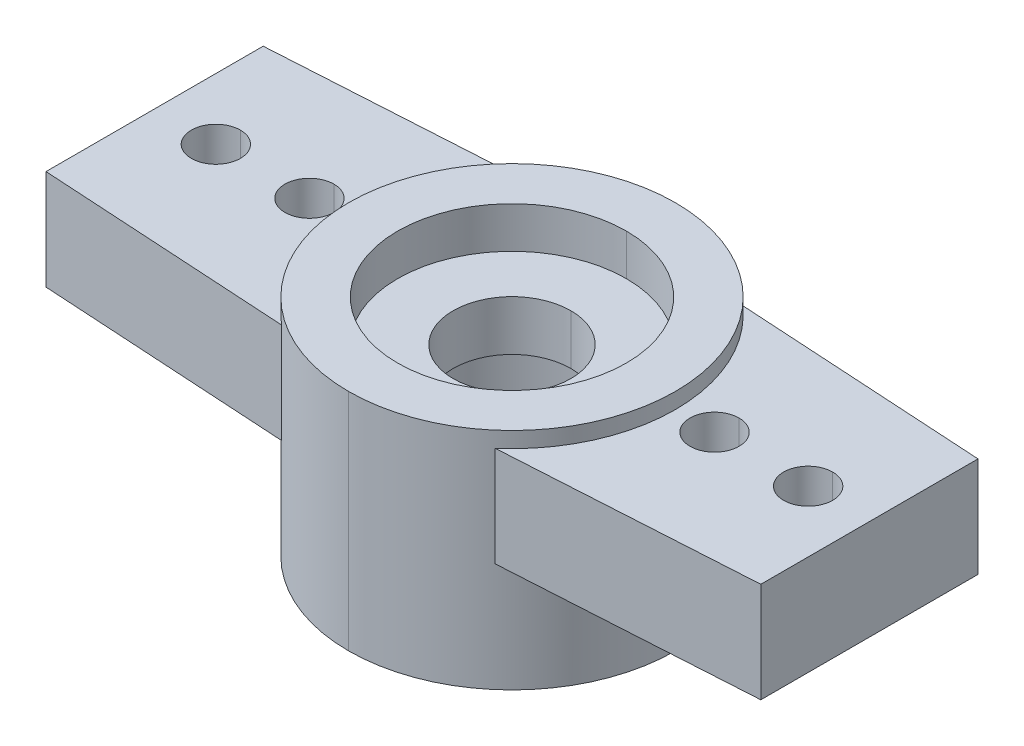
ISO-10303-21;
HEADER;
FILE_DESCRIPTION(('STEP AP214'),'2;1');
FILE_NAME('part.step','',(''),(''),'','','');
FILE_SCHEMA(('AUTOMOTIVE_DESIGN { 1 0 10303 214 1 1 1 1 }'));
ENDSEC;
DATA;
#1=APPLICATION_CONTEXT('core data for automotive mechanical design processes');
#2=APPLICATION_PROTOCOL_DEFINITION('international standard','automotive_design',2000,#1);
#3=PRODUCT_CONTEXT('',#1,'mechanical');
#4=PRODUCT('Part','Part','',(#3));
#5=PRODUCT_RELATED_PRODUCT_CATEGORY('part','',(#4));
#6=PRODUCT_DEFINITION_FORMATION('','',#4);
#7=PRODUCT_DEFINITION_CONTEXT('part definition',#1,'design');
#8=PRODUCT_DEFINITION('design','',#6,#7);
#9=PRODUCT_DEFINITION_SHAPE('','',#8);
#10=(LENGTH_UNIT() NAMED_UNIT(*) SI_UNIT(.MILLI.,.METRE.));
#11=(NAMED_UNIT(*) PLANE_ANGLE_UNIT() SI_UNIT($,.RADIAN.));
#12=(NAMED_UNIT(*) SI_UNIT($,.STERADIAN.) SOLID_ANGLE_UNIT());
#13=UNCERTAINTY_MEASURE_WITH_UNIT(LENGTH_MEASURE(1.E-05),#10,'distance_accuracy_value','');
#14=(GEOMETRIC_REPRESENTATION_CONTEXT(3) GLOBAL_UNCERTAINTY_ASSIGNED_CONTEXT((#13)) GLOBAL_UNIT_ASSIGNED_CONTEXT((#10,
#11,#12)) REPRESENTATION_CONTEXT('',''));
#15=CARTESIAN_POINT('',(0.,0.,0.));
#16=DIRECTION('',(0.,0.,1.));
#17=DIRECTION('',(1.,0.,0.));
#18=AXIS2_PLACEMENT_3D('',#15,#16,#17);
#19=CARTESIAN_POINT('',(0.,2.8,0.));
#20=DIRECTION('',(0.,-1.,0.));
#21=DIRECTION('',(0.,0.,-1.));
#22=AXIS2_PLACEMENT_3D('',#19,#20,#21);
#23=PLANE('',#22);
#24=CARTESIAN_POINT('',(0.,2.8,0.));
#25=DIRECTION('',(0.,-1.,0.));
#26=DIRECTION('',(0.,0.,-1.));
#27=AXIS2_PLACEMENT_3D('',#24,#25,#26);
#28=CIRCLE('',#27,1.235);
#29=CARTESIAN_POINT('',(0.,2.8,-1.235));
#30=VERTEX_POINT('',#29);
#31=CARTESIAN_POINT('',(0.,2.8,1.235));
#32=VERTEX_POINT('',#31);
#33=EDGE_CURVE('E408',#30,#32,#28,.T.);
#34=ORIENTED_EDGE('',*,*,#33,.F.);
#35=CARTESIAN_POINT('',(0.,2.8,0.));
#36=DIRECTION('',(0.,-1.,0.));
#37=DIRECTION('',(0.,0.,-1.));
#38=AXIS2_PLACEMENT_3D('',#35,#36,#37);
#39=CIRCLE('',#38,1.235);
#40=EDGE_CURVE('E351',#32,#30,#39,.T.);
#41=ORIENTED_EDGE('',*,*,#40,.F.);
#42=EDGE_LOOP('',(#34,#41));
#43=FACE_BOUND('',#42,.T.);
#44=CARTESIAN_POINT('',(0.,2.8,0.));
#45=DIRECTION('',(0.,-1.,0.));
#46=DIRECTION('',(0.,0.,-1.));
#47=AXIS2_PLACEMENT_3D('',#44,#45,#46);
#48=CIRCLE('',#47,2.345);
#49=CARTESIAN_POINT('',(0.,2.8,-2.345));
#50=VERTEX_POINT('',#49);
#51=CARTESIAN_POINT('',(0.,2.8,2.345));
#52=VERTEX_POINT('',#51);
#53=EDGE_CURVE('E312',#50,#52,#48,.T.);
#54=ORIENTED_EDGE('',*,*,#53,.T.);
#55=CARTESIAN_POINT('',(0.,2.8,0.));
#56=DIRECTION('',(0.,-1.,0.));
#57=DIRECTION('',(0.,0.,-1.));
#58=AXIS2_PLACEMENT_3D('',#55,#56,#57);
#59=CIRCLE('',#58,2.345);
#60=EDGE_CURVE('E299',#52,#50,#59,.T.);
#61=ORIENTED_EDGE('',*,*,#60,.T.);
#62=EDGE_LOOP('',(#54,#61));
#63=FACE_BOUND('',#62,.T.);
#64=ADVANCED_FACE('F42',(#43,#63),#23,.T.);
#65=CARTESIAN_POINT('',(0.,2.8,0.));
#66=DIRECTION('',(0.,-1.,0.));
#67=DIRECTION('',(0.,0.,-1.));
#68=AXIS2_PLACEMENT_3D('',#65,#66,#67);
#69=CYLINDRICAL_SURFACE('',#68,2.345);
#70=DIRECTION('',(0.,-1.,0.));
#71=VECTOR('',#70,1.);
#72=CARTESIAN_POINT('',(0.,2.8,2.345));
#73=LINE('',#72,#71);
#74=CARTESIAN_POINT('',(0.,0.,2.345));
#75=VERTEX_POINT('',#74);
#76=EDGE_CURVE('E275',#52,#75,#73,.T.);
#77=ORIENTED_EDGE('',*,*,#76,.F.);
#78=ORIENTED_EDGE('',*,*,#53,.F.);
#79=DIRECTION('',(0.,-1.,0.));
#80=VECTOR('',#79,1.);
#81=CARTESIAN_POINT('',(0.,2.8,-2.345));
#82=LINE('',#81,#80);
#83=CARTESIAN_POINT('',(0.,0.,-2.345));
#84=VERTEX_POINT('',#83);
#85=EDGE_CURVE('E281',#50,#84,#82,.T.);
#86=ORIENTED_EDGE('',*,*,#85,.T.);
#87=CARTESIAN_POINT('',(0.,0.,0.));
#88=DIRECTION('',(0.,-1.,0.));
#89=DIRECTION('',(0.,0.,-1.));
#90=AXIS2_PLACEMENT_3D('',#87,#88,#89);
#91=CIRCLE('',#90,2.345);
#92=EDGE_CURVE('E294',#84,#75,#91,.T.);
#93=ORIENTED_EDGE('',*,*,#92,.T.);
#94=EDGE_LOOP('',(#77,#78,#86,#93));
#95=FACE_BOUND('',#94,.T.);
#96=ADVANCED_FACE('F513',(#95),#69,.F.);
#97=CARTESIAN_POINT('',(0.,4.385,0.));
#98=DIRECTION('',(0.,1.,0.));
#99=DIRECTION('',(1.,0.,0.));
#100=AXIS2_PLACEMENT_3D('',#97,#98,#99);
#101=PLANE('',#100);
#102=DIRECTION('',(0.,0.,1.));
#103=VECTOR('',#102,1.);
#104=CARTESIAN_POINT('',(7.5,4.385,0.));
#105=LINE('',#104,#103);
#106=CARTESIAN_POINT('',(7.5,4.385,-2.27874688128844));
#107=VERTEX_POINT('',#106);
#108=CARTESIAN_POINT('',(7.5,4.385,2.27874688128845));
#109=VERTEX_POINT('',#108);
#110=EDGE_CURVE('E303',#107,#109,#105,.T.);
#111=ORIENTED_EDGE('',*,*,#110,.F.);
#112=DIRECTION('',(0.99819540210647,0.,0.0600494730493309));
#113=VECTOR('',#112,1.);
#114=CARTESIAN_POINT('',(0.163635156781981,4.385,-2.72008816777726));
#115=LINE('',#114,#113);
#116=CARTESIAN_POINT('',(2.24296121232624,4.385,-2.595));
#117=VERTEX_POINT('',#116);
#118=EDGE_CURVE('E330',#117,#107,#115,.T.);
#119=ORIENTED_EDGE('',*,*,#118,.F.);
#120=CARTESIAN_POINT('',(0.,4.385,0.));
#121=DIRECTION('',(0.,-1.,0.));
#122=DIRECTION('',(0.,0.,1.));
#123=AXIS2_PLACEMENT_3D('',#120,#121,#122);
#124=CIRCLE('',#123,3.43);
#125=CARTESIAN_POINT('',(2.24296121232624,4.385,2.595));
#126=VERTEX_POINT('',#125);
#127=EDGE_CURVE('E323',#117,#126,#124,.T.);
#128=ORIENTED_EDGE('',*,*,#127,.T.);
#129=DIRECTION('',(0.99819540210647,0.,-0.060049473049331));
#130=VECTOR('',#129,1.);
#131=CARTESIAN_POINT('',(0.163635156781981,4.385,2.72008816777726));
#132=LINE('',#131,#130);
#133=EDGE_CURVE('E433',#126,#109,#132,.T.);
#134=ORIENTED_EDGE('',*,*,#133,.T.);
#135=EDGE_LOOP('',(#111,#119,#128,#134));
#136=FACE_BOUND('',#135,.T.);
#137=CARTESIAN_POINT('',(4.25,4.385,0.));
#138=DIRECTION('',(0.,-1.,0.));
#139=DIRECTION('',(0.,0.,1.));
#140=AXIS2_PLACEMENT_3D('',#137,#138,#139);
#141=CIRCLE('',#140,0.515);
#142=CARTESIAN_POINT('',(4.25,4.385,0.515));
#143=VERTEX_POINT('',#142);
#144=CARTESIAN_POINT('',(4.25,4.385,-0.515));
#145=VERTEX_POINT('',#144);
#146=EDGE_CURVE('E424',#143,#145,#141,.T.);
#147=ORIENTED_EDGE('',*,*,#146,.T.);
#148=CARTESIAN_POINT('',(4.25,4.385,0.));
#149=DIRECTION('',(0.,-1.,0.));
#150=DIRECTION('',(0.,0.,1.));
#151=AXIS2_PLACEMENT_3D('',#148,#149,#150);
#152=CIRCLE('',#151,0.515);
#153=EDGE_CURVE('E309',#145,#143,#152,.T.);
#154=ORIENTED_EDGE('',*,*,#153,.T.);
#155=EDGE_LOOP('',(#147,#154));
#156=FACE_BOUND('',#155,.T.);
#157=CARTESIAN_POINT('',(6.214,4.385,0.));
#158=DIRECTION('',(0.,-1.,0.));
#159=DIRECTION('',(0.,0.,1.));
#160=AXIS2_PLACEMENT_3D('',#157,#158,#159);
#161=CIRCLE('',#160,0.515);
#162=CARTESIAN_POINT('',(6.214,4.385,0.515000000000014));
#163=VERTEX_POINT('',#162);
#164=CARTESIAN_POINT('',(6.214,4.385,-0.514999999999986));
#165=VERTEX_POINT('',#164);
#166=EDGE_CURVE('E336',#163,#165,#161,.T.);
#167=ORIENTED_EDGE('',*,*,#166,.T.);
#168=CARTESIAN_POINT('',(6.214,4.385,0.));
#169=DIRECTION('',(0.,-1.,0.));
#170=DIRECTION('',(0.,0.,1.));
#171=AXIS2_PLACEMENT_3D('',#168,#169,#170);
#172=CIRCLE('',#171,0.515);
#173=EDGE_CURVE('E304',#165,#163,#172,.T.);
#174=ORIENTED_EDGE('',*,*,#173,.T.);
#175=EDGE_LOOP('',(#167,#174));
#176=FACE_BOUND('',#175,.T.);
#177=ADVANCED_FACE('F519',(#136,#156,#176),#101,.T.);
#178=CARTESIAN_POINT('',(0.,2.285,0.));
#179=DIRECTION('',(0.,1.,0.));
#180=DIRECTION('',(1.,0.,0.));
#181=AXIS2_PLACEMENT_3D('',#178,#179,#180);
#182=PLANE('',#181);
#183=CARTESIAN_POINT('',(4.25,2.285,0.));
#184=DIRECTION('',(0.,-1.,0.));
#185=DIRECTION('',(0.,0.,1.));
#186=AXIS2_PLACEMENT_3D('',#183,#184,#185);
#187=CIRCLE('',#186,0.515);
#188=CARTESIAN_POINT('',(4.25,2.285,0.515));
#189=VERTEX_POINT('',#188);
#190=CARTESIAN_POINT('',(4.25,2.285,-0.515));
#191=VERTEX_POINT('',#190);
#192=EDGE_CURVE('E277',#189,#191,#187,.T.);
#193=ORIENTED_EDGE('',*,*,#192,.F.);
#194=CARTESIAN_POINT('',(4.25,2.285,0.));
#195=DIRECTION('',(0.,-1.,0.));
#196=DIRECTION('',(0.,0.,1.));
#197=AXIS2_PLACEMENT_3D('',#194,#195,#196);
#198=CIRCLE('',#197,0.515);
#199=EDGE_CURVE('E306',#191,#189,#198,.T.);
#200=ORIENTED_EDGE('',*,*,#199,.F.);
#201=EDGE_LOOP('',(#193,#200));
#202=FACE_BOUND('',#201,.T.);
#203=CARTESIAN_POINT('',(6.214,2.285,0.));
#204=DIRECTION('',(0.,-1.,0.));
#205=DIRECTION('',(0.,0.,1.));
#206=AXIS2_PLACEMENT_3D('',#203,#204,#205);
#207=CIRCLE('',#206,0.515);
#208=CARTESIAN_POINT('',(6.214,2.285,0.515000000000014));
#209=VERTEX_POINT('',#208);
#210=CARTESIAN_POINT('',(6.214,2.285,-0.514999999999986));
#211=VERTEX_POINT('',#210);
#212=EDGE_CURVE('E342',#209,#211,#207,.T.);
#213=ORIENTED_EDGE('',*,*,#212,.F.);
#214=CARTESIAN_POINT('',(6.214,2.285,0.));
#215=DIRECTION('',(0.,-1.,0.));
#216=DIRECTION('',(0.,0.,1.));
#217=AXIS2_PLACEMENT_3D('',#214,#215,#216);
#218=CIRCLE('',#217,0.515);
#219=EDGE_CURVE('E307',#211,#209,#218,.T.);
#220=ORIENTED_EDGE('',*,*,#219,.F.);
#221=EDGE_LOOP('',(#213,#220));
#222=FACE_BOUND('',#221,.T.);
#223=DIRECTION('',(0.99819540210647,0.,0.0600494730493309));
#224=VECTOR('',#223,1.);
#225=CARTESIAN_POINT('',(0.163635156781981,2.285,-2.72008816777726));
#226=LINE('',#225,#224);
#227=CARTESIAN_POINT('',(2.24296121232624,2.285,-2.595));
#228=VERTEX_POINT('',#227);
#229=CARTESIAN_POINT('',(7.5,2.285,-2.27874688128845));
#230=VERTEX_POINT('',#229);
#231=EDGE_CURVE('E381',#228,#230,#226,.T.);
#232=ORIENTED_EDGE('',*,*,#231,.T.);
#233=DIRECTION('',(0.,0.,-1.));
#234=VECTOR('',#233,1.);
#235=CARTESIAN_POINT('',(7.5,2.285,2.27874688128845));
#236=LINE('',#235,#234);
#237=CARTESIAN_POINT('',(7.5,2.285,2.27874688128845));
#238=VERTEX_POINT('',#237);
#239=EDGE_CURVE('E57',#238,#230,#236,.T.);
#240=ORIENTED_EDGE('',*,*,#239,.F.);
#241=DIRECTION('',(0.99819540210647,0.,-0.060049473049331));
#242=VECTOR('',#241,1.);
#243=CARTESIAN_POINT('',(0.163635156781981,2.285,2.72008816777726));
#244=LINE('',#243,#242);
#245=CARTESIAN_POINT('',(2.24296121232624,2.285,2.595));
#246=VERTEX_POINT('',#245);
#247=EDGE_CURVE('E458',#246,#238,#244,.T.);
#248=ORIENTED_EDGE('',*,*,#247,.F.);
#249=CARTESIAN_POINT('',(0.,2.285,0.));
#250=DIRECTION('',(0.,-1.,0.));
#251=DIRECTION('',(0.,0.,1.));
#252=AXIS2_PLACEMENT_3D('',#249,#250,#251);
#253=CIRCLE('',#252,3.43);
#254=EDGE_CURVE('E324',#228,#246,#253,.T.);
#255=ORIENTED_EDGE('',*,*,#254,.F.);
#256=EDGE_LOOP('',(#232,#240,#248,#255));
#257=FACE_BOUND('',#256,.T.);
#258=ADVANCED_FACE('F527',(#202,#222,#257),#182,.F.);
#259=CARTESIAN_POINT('',(4.25,2.285,0.));
#260=DIRECTION('',(0.,1.,0.));
#261=DIRECTION('',(0.,0.,1.));
#262=AXIS2_PLACEMENT_3D('',#259,#260,#261);
#263=CYLINDRICAL_SURFACE('',#262,0.515);
#264=DIRECTION('',(0.,1.,0.));
#265=VECTOR('',#264,1.);
#266=CARTESIAN_POINT('',(4.25,2.285,-0.515));
#267=LINE('',#266,#265);
#268=EDGE_CURVE('E280',#191,#145,#267,.T.);
#269=ORIENTED_EDGE('',*,*,#268,.F.);
#270=ORIENTED_EDGE('',*,*,#199,.T.);
#271=DIRECTION('',(0.,1.,0.));
#272=VECTOR('',#271,1.);
#273=CARTESIAN_POINT('',(4.25,2.285,0.515));
#274=LINE('',#273,#272);
#275=EDGE_CURVE('E346',#189,#143,#274,.T.);
#276=ORIENTED_EDGE('',*,*,#275,.T.);
#277=ORIENTED_EDGE('',*,*,#153,.F.);
#278=EDGE_LOOP('',(#269,#270,#276,#277));
#279=FACE_BOUND('',#278,.T.);
#280=ADVANCED_FACE('F606',(#279),#263,.F.);
#281=CARTESIAN_POINT('',(6.214,2.285,0.));
#282=DIRECTION('',(0.,1.,0.));
#283=DIRECTION('',(0.,0.,1.));
#284=AXIS2_PLACEMENT_3D('',#281,#282,#283);
#285=CYLINDRICAL_SURFACE('',#284,0.515);
#286=DIRECTION('',(0.,1.,0.));
#287=VECTOR('',#286,1.);
#288=CARTESIAN_POINT('',(6.214,2.285,-0.514999999999986));
#289=LINE('',#288,#287);
#290=EDGE_CURVE('E341',#211,#165,#289,.T.);
#291=ORIENTED_EDGE('',*,*,#290,.F.);
#292=ORIENTED_EDGE('',*,*,#219,.T.);
#293=DIRECTION('',(0.,1.,0.));
#294=VECTOR('',#293,1.);
#295=CARTESIAN_POINT('',(6.214,2.285,0.515000000000014));
#296=LINE('',#295,#294);
#297=EDGE_CURVE('E340',#209,#163,#296,.T.);
#298=ORIENTED_EDGE('',*,*,#297,.T.);
#299=ORIENTED_EDGE('',*,*,#173,.F.);
#300=EDGE_LOOP('',(#291,#292,#298,#299));
#301=FACE_BOUND('',#300,.T.);
#302=ADVANCED_FACE('F524',(#301),#285,.F.);
#303=CARTESIAN_POINT('',(0.163635156781981,2.285,2.72008816777726));
#304=DIRECTION('',(0.060049473049331,0.,0.99819540210647));
#305=DIRECTION('',(0.,-1.,0.));
#306=AXIS2_PLACEMENT_3D('',#303,#304,#305);
#307=PLANE('',#306);
#308=DIRECTION('',(0.,-1.,0.));
#309=VECTOR('',#308,1.);
#310=CARTESIAN_POINT('',(7.5,12.285,2.27874688128845));
#311=LINE('',#310,#309);
#312=EDGE_CURVE('E255',#109,#238,#311,.T.);
#313=ORIENTED_EDGE('',*,*,#312,.F.);
#314=ORIENTED_EDGE('',*,*,#133,.F.);
#315=DIRECTION('',(0.,1.,0.));
#316=VECTOR('',#315,1.);
#317=CARTESIAN_POINT('',(2.24296121232624,2.285,2.595));
#318=LINE('',#317,#316);
#319=EDGE_CURVE('E319',#246,#126,#318,.T.);
#320=ORIENTED_EDGE('',*,*,#319,.F.);
#321=ORIENTED_EDGE('',*,*,#247,.T.);
#322=EDGE_LOOP('',(#313,#314,#320,#321));
#323=FACE_BOUND('',#322,.T.);
#324=ADVANCED_FACE('F540',(#323),#307,.T.);
#325=CARTESIAN_POINT('',(0.163635156781981,2.285,-2.72008816777726));
#326=DIRECTION('',(-0.0600494730493309,0.,0.99819540210647));
#327=DIRECTION('',(0.,1.,0.));
#328=AXIS2_PLACEMENT_3D('',#325,#326,#327);
#329=PLANE('',#328);
#330=ORIENTED_EDGE('',*,*,#118,.T.);
#331=DIRECTION('',(0.,-1.,0.));
#332=VECTOR('',#331,1.);
#333=CARTESIAN_POINT('',(7.5,2.285,-2.27874688128845));
#334=LINE('',#333,#332);
#335=EDGE_CURVE('E11',#107,#230,#334,.T.);
#336=ORIENTED_EDGE('',*,*,#335,.T.);
#337=ORIENTED_EDGE('',*,*,#231,.F.);
#338=DIRECTION('',(0.,1.,0.));
#339=VECTOR('',#338,1.);
#340=CARTESIAN_POINT('',(2.24296121232624,2.285,-2.595));
#341=LINE('',#340,#339);
#342=EDGE_CURVE('E394',#228,#117,#341,.T.);
#343=ORIENTED_EDGE('',*,*,#342,.T.);
#344=EDGE_LOOP('',(#330,#336,#337,#343));
#345=FACE_BOUND('',#344,.T.);
#346=ADVANCED_FACE('F537',(#345),#329,.F.);
#347=CARTESIAN_POINT('',(0.,4.385,0.));
#348=DIRECTION('',(0.,1.,0.));
#349=DIRECTION('',(1.,0.,0.));
#350=AXIS2_PLACEMENT_3D('',#347,#348,#349);
#351=PLANE('',#350);
#352=DIRECTION('',(0.,0.,-1.));
#353=VECTOR('',#352,1.);
#354=CARTESIAN_POINT('',(-7.5,4.385,0.));
#355=LINE('',#354,#353);
#356=CARTESIAN_POINT('',(-7.5,4.385,2.27874688128845));
#357=VERTEX_POINT('',#356);
#358=CARTESIAN_POINT('',(-7.5,4.385,-2.27874688128845));
#359=VERTEX_POINT('',#358);
#360=EDGE_CURVE('E243',#357,#359,#355,.T.);
#361=ORIENTED_EDGE('',*,*,#360,.F.);
#362=DIRECTION('',(-0.99819540210647,0.,-0.060049473049331));
#363=VECTOR('',#362,1.);
#364=CARTESIAN_POINT('',(-0.163635156781981,4.385,2.72008816777726));
#365=LINE('',#364,#363);
#366=CARTESIAN_POINT('',(-2.24296121232624,4.385,2.595));
#367=VERTEX_POINT('',#366);
#368=EDGE_CURVE('E355',#367,#357,#365,.T.);
#369=ORIENTED_EDGE('',*,*,#368,.F.);
#370=CARTESIAN_POINT('',(0.,4.385,0.));
#371=DIRECTION('',(0.,1.,0.));
#372=DIRECTION('',(0.,0.,1.));
#373=AXIS2_PLACEMENT_3D('',#370,#371,#372);
#374=CIRCLE('',#373,3.43);
#375=CARTESIAN_POINT('',(-2.24296121232624,4.385,-2.595));
#376=VERTEX_POINT('',#375);
#377=EDGE_CURVE('E284',#376,#367,#374,.T.);
#378=ORIENTED_EDGE('',*,*,#377,.F.);
#379=DIRECTION('',(-0.99819540210647,0.,0.0600494730493309));
#380=VECTOR('',#379,1.);
#381=CARTESIAN_POINT('',(-0.163635156781981,4.385,-2.72008816777726));
#382=LINE('',#381,#380);
#383=EDGE_CURVE('E263',#376,#359,#382,.T.);
#384=ORIENTED_EDGE('',*,*,#383,.T.);
#385=EDGE_LOOP('',(#361,#369,#378,#384));
#386=FACE_BOUND('',#385,.T.);
#387=CARTESIAN_POINT('',(-4.25,4.385,0.));
#388=DIRECTION('',(0.,1.,0.));
#389=DIRECTION('',(0.,0.,1.));
#390=AXIS2_PLACEMENT_3D('',#387,#388,#389);
#391=CIRCLE('',#390,0.515);
#392=CARTESIAN_POINT('',(-4.25,4.385,0.515));
#393=VERTEX_POINT('',#392);
#394=CARTESIAN_POINT('',(-4.25,4.385,-0.515));
#395=VERTEX_POINT('',#394);
#396=EDGE_CURVE('E293',#393,#395,#391,.T.);
#397=ORIENTED_EDGE('',*,*,#396,.F.);
#398=CARTESIAN_POINT('',(-4.25,4.385,0.));
#399=DIRECTION('',(0.,1.,0.));
#400=DIRECTION('',(0.,0.,1.));
#401=AXIS2_PLACEMENT_3D('',#398,#399,#400);
#402=CIRCLE('',#401,0.515);
#403=EDGE_CURVE('E387',#395,#393,#402,.T.);
#404=ORIENTED_EDGE('',*,*,#403,.F.);
#405=EDGE_LOOP('',(#397,#404));
#406=FACE_BOUND('',#405,.T.);
#407=CARTESIAN_POINT('',(-6.214,4.385,0.));
#408=DIRECTION('',(0.,1.,0.));
#409=DIRECTION('',(0.,0.,1.));
#410=AXIS2_PLACEMENT_3D('',#407,#408,#409);
#411=CIRCLE('',#410,0.515);
#412=CARTESIAN_POINT('',(-6.214,4.385,0.515000000000014));
#413=VERTEX_POINT('',#412);
#414=CARTESIAN_POINT('',(-6.214,4.385,-0.514999999999986));
#415=VERTEX_POINT('',#414);
#416=EDGE_CURVE('E269',#413,#415,#411,.T.);
#417=ORIENTED_EDGE('',*,*,#416,.F.);
#418=CARTESIAN_POINT('',(-6.214,4.385,0.));
#419=DIRECTION('',(0.,1.,0.));
#420=DIRECTION('',(0.,0.,1.));
#421=AXIS2_PLACEMENT_3D('',#418,#419,#420);
#422=CIRCLE('',#421,0.515);
#423=EDGE_CURVE('E318',#415,#413,#422,.T.);
#424=ORIENTED_EDGE('',*,*,#423,.F.);
#425=EDGE_LOOP('',(#417,#424));
#426=FACE_BOUND('',#425,.T.);
#427=ADVANCED_FACE('F539',(#386,#406,#426),#351,.T.);
#428=CARTESIAN_POINT('',(0.,2.285,0.));
#429=DIRECTION('',(0.,1.,0.));
#430=DIRECTION('',(1.,0.,0.));
#431=AXIS2_PLACEMENT_3D('',#428,#429,#430);
#432=PLANE('',#431);
#433=CARTESIAN_POINT('',(-4.25,2.285,0.));
#434=DIRECTION('',(0.,1.,0.));
#435=DIRECTION('',(0.,0.,1.));
#436=AXIS2_PLACEMENT_3D('',#433,#434,#435);
#437=CIRCLE('',#436,0.515);
#438=CARTESIAN_POINT('',(-4.25,2.285,0.515));
#439=VERTEX_POINT('',#438);
#440=CARTESIAN_POINT('',(-4.25,2.285,-0.515));
#441=VERTEX_POINT('',#440);
#442=EDGE_CURVE('E290',#439,#441,#437,.T.);
#443=ORIENTED_EDGE('',*,*,#442,.T.);
#444=CARTESIAN_POINT('',(-4.25,2.285,0.));
#445=DIRECTION('',(0.,1.,0.));
#446=DIRECTION('',(0.,0.,1.));
#447=AXIS2_PLACEMENT_3D('',#444,#445,#446);
#448=CIRCLE('',#447,0.515);
#449=EDGE_CURVE('E373',#441,#439,#448,.T.);
#450=ORIENTED_EDGE('',*,*,#449,.T.);
#451=EDGE_LOOP('',(#443,#450));
#452=FACE_BOUND('',#451,.T.);
#453=CARTESIAN_POINT('',(-6.214,2.285,0.));
#454=DIRECTION('',(0.,1.,0.));
#455=DIRECTION('',(0.,0.,1.));
#456=AXIS2_PLACEMENT_3D('',#453,#454,#455);
#457=CIRCLE('',#456,0.515);
#458=CARTESIAN_POINT('',(-6.214,2.285,0.515000000000014));
#459=VERTEX_POINT('',#458);
#460=CARTESIAN_POINT('',(-6.214,2.285,-0.514999999999986));
#461=VERTEX_POINT('',#460);
#462=EDGE_CURVE('E262',#459,#461,#457,.T.);
#463=ORIENTED_EDGE('',*,*,#462,.T.);
#464=CARTESIAN_POINT('',(-6.214,2.285,0.));
#465=DIRECTION('',(0.,1.,0.));
#466=DIRECTION('',(0.,0.,1.));
#467=AXIS2_PLACEMENT_3D('',#464,#465,#466);
#468=CIRCLE('',#467,0.515);
#469=EDGE_CURVE('E386',#461,#459,#468,.T.);
#470=ORIENTED_EDGE('',*,*,#469,.T.);
#471=EDGE_LOOP('',(#463,#470));
#472=FACE_BOUND('',#471,.T.);
#473=DIRECTION('',(-0.99819540210647,0.,-0.060049473049331));
#474=VECTOR('',#473,1.);
#475=CARTESIAN_POINT('',(-0.163635156781981,2.285,2.72008816777726));
#476=LINE('',#475,#474);
#477=CARTESIAN_POINT('',(-2.24296121232624,2.285,2.595));
#478=VERTEX_POINT('',#477);
#479=CARTESIAN_POINT('',(-7.5,2.285,2.27874688128845));
#480=VERTEX_POINT('',#479);
#481=EDGE_CURVE('E254',#478,#480,#476,.T.);
#482=ORIENTED_EDGE('',*,*,#481,.T.);
#483=DIRECTION('',(0.,0.,1.));
#484=VECTOR('',#483,1.);
#485=CARTESIAN_POINT('',(-7.5,2.285,2.27874688128845));
#486=LINE('',#485,#484);
#487=CARTESIAN_POINT('',(-7.5,2.285,-2.27874688128845));
#488=VERTEX_POINT('',#487);
#489=EDGE_CURVE('E64',#488,#480,#486,.T.);
#490=ORIENTED_EDGE('',*,*,#489,.F.);
#491=DIRECTION('',(-0.99819540210647,0.,0.0600494730493309));
#492=VECTOR('',#491,1.);
#493=CARTESIAN_POINT('',(-0.163635156781981,2.285,-2.72008816777726));
#494=LINE('',#493,#492);
#495=CARTESIAN_POINT('',(-2.24296121232624,2.285,-2.595));
#496=VERTEX_POINT('',#495);
#497=EDGE_CURVE('E252',#496,#488,#494,.T.);
#498=ORIENTED_EDGE('',*,*,#497,.F.);
#499=CARTESIAN_POINT('',(0.,2.285,0.));
#500=DIRECTION('',(0.,1.,0.));
#501=DIRECTION('',(0.,0.,1.));
#502=AXIS2_PLACEMENT_3D('',#499,#500,#501);
#503=CIRCLE('',#502,3.43);
#504=EDGE_CURVE('E285',#496,#478,#503,.T.);
#505=ORIENTED_EDGE('',*,*,#504,.T.);
#506=EDGE_LOOP('',(#482,#490,#498,#505));
#507=FACE_BOUND('',#506,.T.);
#508=ADVANCED_FACE('F250',(#452,#472,#507),#432,.F.);
#509=CARTESIAN_POINT('',(-4.25,2.285,0.));
#510=DIRECTION('',(0.,1.,0.));
#511=DIRECTION('',(0.,0.,1.));
#512=AXIS2_PLACEMENT_3D('',#509,#510,#511);
#513=CYLINDRICAL_SURFACE('',#512,0.515);
#514=DIRECTION('',(0.,1.,0.));
#515=VECTOR('',#514,1.);
#516=CARTESIAN_POINT('',(-4.25,2.285,-0.515));
#517=LINE('',#516,#515);
#518=EDGE_CURVE('E377',#441,#395,#517,.T.);
#519=ORIENTED_EDGE('',*,*,#518,.F.);
#520=ORIENTED_EDGE('',*,*,#442,.F.);
#521=DIRECTION('',(0.,1.,0.));
#522=VECTOR('',#521,1.);
#523=CARTESIAN_POINT('',(-4.25,2.285,0.515));
#524=LINE('',#523,#522);
#525=EDGE_CURVE('E382',#439,#393,#524,.T.);
#526=ORIENTED_EDGE('',*,*,#525,.T.);
#527=ORIENTED_EDGE('',*,*,#396,.T.);
#528=EDGE_LOOP('',(#519,#520,#526,#527));
#529=FACE_BOUND('',#528,.T.);
#530=ADVANCED_FACE('F587',(#529),#513,.F.);
#531=CARTESIAN_POINT('',(-6.214,2.285,0.));
#532=DIRECTION('',(0.,1.,0.));
#533=DIRECTION('',(0.,0.,1.));
#534=AXIS2_PLACEMENT_3D('',#531,#532,#533);
#535=CYLINDRICAL_SURFACE('',#534,0.515);
#536=DIRECTION('',(0.,1.,0.));
#537=VECTOR('',#536,1.);
#538=CARTESIAN_POINT('',(-6.214,2.285,-0.514999999999986));
#539=LINE('',#538,#537);
#540=EDGE_CURVE('E398',#461,#415,#539,.T.);
#541=ORIENTED_EDGE('',*,*,#540,.F.);
#542=ORIENTED_EDGE('',*,*,#462,.F.);
#543=DIRECTION('',(0.,1.,0.));
#544=VECTOR('',#543,1.);
#545=CARTESIAN_POINT('',(-6.214,2.285,0.515000000000014));
#546=LINE('',#545,#544);
#547=EDGE_CURVE('E313',#459,#413,#546,.T.);
#548=ORIENTED_EDGE('',*,*,#547,.T.);
#549=ORIENTED_EDGE('',*,*,#416,.T.);
#550=EDGE_LOOP('',(#541,#542,#548,#549));
#551=FACE_BOUND('',#550,.T.);
#552=ADVANCED_FACE('F581',(#551),#535,.F.);
#553=CARTESIAN_POINT('',(-0.163635156781981,2.285,-2.72008816777726));
#554=DIRECTION('',(-0.0600494730493309,0.,-0.99819540210647));
#555=DIRECTION('',(-0.99819540210647,0.,0.0600494730493309));
#556=AXIS2_PLACEMENT_3D('',#553,#554,#555);
#557=PLANE('',#556);
#558=DIRECTION('',(0.,-1.,0.));
#559=VECTOR('',#558,1.);
#560=CARTESIAN_POINT('',(-7.5,12.285,-2.27874688128845));
#561=LINE('',#560,#559);
#562=EDGE_CURVE('E240',#359,#488,#561,.T.);
#563=ORIENTED_EDGE('',*,*,#562,.F.);
#564=ORIENTED_EDGE('',*,*,#383,.F.);
#565=DIRECTION('',(0.,1.,0.));
#566=VECTOR('',#565,1.);
#567=CARTESIAN_POINT('',(-2.24296121232624,2.285,-2.595));
#568=LINE('',#567,#566);
#569=EDGE_CURVE('E259',#496,#376,#568,.T.);
#570=ORIENTED_EDGE('',*,*,#569,.F.);
#571=ORIENTED_EDGE('',*,*,#497,.T.);
#572=EDGE_LOOP('',(#563,#564,#570,#571));
#573=FACE_BOUND('',#572,.T.);
#574=ADVANCED_FACE('F257',(#573),#557,.T.);
#575=CARTESIAN_POINT('',(-0.163635156781981,2.285,2.72008816777726));
#576=DIRECTION('',(0.060049473049331,0.,-0.99819540210647));
#577=DIRECTION('',(0.,-1.,0.));
#578=AXIS2_PLACEMENT_3D('',#575,#576,#577);
#579=PLANE('',#578);
#580=ORIENTED_EDGE('',*,*,#368,.T.);
#581=DIRECTION('',(0.,-1.,0.));
#582=VECTOR('',#581,1.);
#583=CARTESIAN_POINT('',(-7.5,2.285,2.27874688128845));
#584=LINE('',#583,#582);
#585=EDGE_CURVE('E50',#357,#480,#584,.T.);
#586=ORIENTED_EDGE('',*,*,#585,.T.);
#587=ORIENTED_EDGE('',*,*,#481,.F.);
#588=DIRECTION('',(0.,1.,0.));
#589=VECTOR('',#588,1.);
#590=CARTESIAN_POINT('',(-2.24296121232624,2.285,2.595));
#591=LINE('',#590,#589);
#592=EDGE_CURVE('E327',#478,#367,#591,.T.);
#593=ORIENTED_EDGE('',*,*,#592,.T.);
#594=EDGE_LOOP('',(#580,#586,#587,#593));
#595=FACE_BOUND('',#594,.T.);
#596=ADVANCED_FACE('F44',(#595),#579,.F.);
#597=CARTESIAN_POINT('',(0.,3.85,0.));
#598=DIRECTION('',(0.,1.,0.));
#599=DIRECTION('',(1.,0.,0.));
#600=AXIS2_PLACEMENT_3D('',#597,#598,#599);
#601=PLANE('',#600);
#602=CARTESIAN_POINT('',(0.,3.85,0.));
#603=DIRECTION('',(0.,1.,0.));
#604=DIRECTION('',(0.,0.,1.));
#605=AXIS2_PLACEMENT_3D('',#602,#603,#604);
#606=CIRCLE('',#605,1.235);
#607=CARTESIAN_POINT('',(0.,3.85,-1.235));
#608=VERTEX_POINT('',#607);
#609=CARTESIAN_POINT('',(0.,3.85,1.235));
#610=VERTEX_POINT('',#609);
#611=EDGE_CURVE('E352',#608,#610,#606,.T.);
#612=ORIENTED_EDGE('',*,*,#611,.F.);
#613=CARTESIAN_POINT('',(0.,3.85,0.));
#614=DIRECTION('',(0.,1.,0.));
#615=DIRECTION('',(0.,0.,1.));
#616=AXIS2_PLACEMENT_3D('',#613,#614,#615);
#617=CIRCLE('',#616,1.235);
#618=EDGE_CURVE('E405',#610,#608,#617,.T.);
#619=ORIENTED_EDGE('',*,*,#618,.F.);
#620=EDGE_LOOP('',(#612,#619));
#621=FACE_BOUND('',#620,.T.);
#622=CARTESIAN_POINT('',(0.,3.85,0.));
#623=DIRECTION('',(0.,1.,0.));
#624=DIRECTION('',(0.,0.,1.));
#625=AXIS2_PLACEMENT_3D('',#622,#623,#624);
#626=CIRCLE('',#625,2.4);
#627=CARTESIAN_POINT('',(0.,3.85,2.4));
#628=VERTEX_POINT('',#627);
#629=CARTESIAN_POINT('',(0.,3.85,-2.4));
#630=VERTEX_POINT('',#629);
#631=EDGE_CURVE('E297',#628,#630,#626,.T.);
#632=ORIENTED_EDGE('',*,*,#631,.T.);
#633=CARTESIAN_POINT('',(0.,3.85,0.));
#634=DIRECTION('',(0.,1.,0.));
#635=DIRECTION('',(0.,0.,1.));
#636=AXIS2_PLACEMENT_3D('',#633,#634,#635);
#637=CIRCLE('',#636,2.4);
#638=EDGE_CURVE('E317',#630,#628,#637,.T.);
#639=ORIENTED_EDGE('',*,*,#638,.T.);
#640=EDGE_LOOP('',(#632,#639));
#641=FACE_BOUND('',#640,.T.);
#642=ADVANCED_FACE('F507',(#621,#641),#601,.T.);
#643=CARTESIAN_POINT('',(0.,3.85,0.));
#644=DIRECTION('',(0.,1.,0.));
#645=DIRECTION('',(0.,0.,1.));
#646=AXIS2_PLACEMENT_3D('',#643,#644,#645);
#647=CYLINDRICAL_SURFACE('',#646,2.4);
#648=DIRECTION('',(0.,1.,0.));
#649=VECTOR('',#648,1.);
#650=CARTESIAN_POINT('',(0.,3.85,-2.4));
#651=LINE('',#650,#649);
#652=CARTESIAN_POINT('',(0.,4.715,-2.4));
#653=VERTEX_POINT('',#652);
#654=EDGE_CURVE('E420',#630,#653,#651,.T.);
#655=ORIENTED_EDGE('',*,*,#654,.F.);
#656=ORIENTED_EDGE('',*,*,#631,.F.);
#657=DIRECTION('',(0.,1.,0.));
#658=VECTOR('',#657,1.);
#659=CARTESIAN_POINT('',(0.,3.85,2.4));
#660=LINE('',#659,#658);
#661=CARTESIAN_POINT('',(0.,4.715,2.4));
#662=VERTEX_POINT('',#661);
#663=EDGE_CURVE('E415',#628,#662,#660,.T.);
#664=ORIENTED_EDGE('',*,*,#663,.T.);
#665=CARTESIAN_POINT('',(0.,4.715,0.));
#666=DIRECTION('',(0.,1.,0.));
#667=DIRECTION('',(0.,0.,1.));
#668=AXIS2_PLACEMENT_3D('',#665,#666,#667);
#669=CIRCLE('',#668,2.4);
#670=EDGE_CURVE('E298',#662,#653,#669,.T.);
#671=ORIENTED_EDGE('',*,*,#670,.T.);
#672=EDGE_LOOP('',(#655,#656,#664,#671));
#673=FACE_BOUND('',#672,.T.);
#674=ADVANCED_FACE('F498',(#673),#647,.F.);
#675=CARTESIAN_POINT('',(0.,0.,0.));
#676=DIRECTION('',(0.,1.,0.));
#677=DIRECTION('',(1.,0.,0.));
#678=AXIS2_PLACEMENT_3D('',#675,#676,#677);
#679=PLANE('',#678);
#680=ORIENTED_EDGE('',*,*,#92,.F.);
#681=CARTESIAN_POINT('',(0.,0.,0.));
#682=DIRECTION('',(0.,-1.,0.));
#683=DIRECTION('',(0.,0.,-1.));
#684=AXIS2_PLACEMENT_3D('',#681,#682,#683);
#685=CIRCLE('',#684,2.345);
#686=EDGE_CURVE('E286',#75,#84,#685,.T.);
#687=ORIENTED_EDGE('',*,*,#686,.F.);
#688=EDGE_LOOP('',(#680,#687));
#689=FACE_BOUND('',#688,.T.);
#690=CARTESIAN_POINT('',(0.,0.,0.));
#691=DIRECTION('',(0.,1.,0.));
#692=DIRECTION('',(0.,0.,1.));
#693=AXIS2_PLACEMENT_3D('',#690,#691,#692);
#694=CIRCLE('',#693,3.43);
#695=CARTESIAN_POINT('',(0.,0.,-3.43));
#696=VERTEX_POINT('',#695);
#697=CARTESIAN_POINT('',(0.,0.,3.43));
#698=VERTEX_POINT('',#697);
#699=EDGE_CURVE('E356',#696,#698,#694,.T.);
#700=ORIENTED_EDGE('',*,*,#699,.F.);
#701=CARTESIAN_POINT('',(0.,0.,0.));
#702=DIRECTION('',(0.,1.,0.));
#703=DIRECTION('',(0.,0.,1.));
#704=AXIS2_PLACEMENT_3D('',#701,#702,#703);
#705=CIRCLE('',#704,3.43);
#706=EDGE_CURVE('E364',#698,#696,#705,.T.);
#707=ORIENTED_EDGE('',*,*,#706,.F.);
#708=EDGE_LOOP('',(#700,#707));
#709=FACE_BOUND('',#708,.T.);
#710=ADVANCED_FACE('F495',(#689,#709),#679,.F.);
#711=CARTESIAN_POINT('',(0.,4.715,0.));
#712=DIRECTION('',(0.,1.,0.));
#713=DIRECTION('',(1.,0.,0.));
#714=AXIS2_PLACEMENT_3D('',#711,#712,#713);
#715=PLANE('',#714);
#716=ORIENTED_EDGE('',*,*,#670,.F.);
#717=CARTESIAN_POINT('',(0.,4.715,0.));
#718=DIRECTION('',(0.,1.,0.));
#719=DIRECTION('',(0.,0.,1.));
#720=AXIS2_PLACEMENT_3D('',#717,#718,#719);
#721=CIRCLE('',#720,2.4);
#722=EDGE_CURVE('E416',#653,#662,#721,.T.);
#723=ORIENTED_EDGE('',*,*,#722,.F.);
#724=EDGE_LOOP('',(#716,#723));
#725=FACE_BOUND('',#724,.T.);
#726=CARTESIAN_POINT('',(0.,4.715,0.));
#727=DIRECTION('',(0.,1.,0.));
#728=DIRECTION('',(0.,0.,1.));
#729=AXIS2_PLACEMENT_3D('',#726,#727,#728);
#730=CIRCLE('',#729,3.43);
#731=CARTESIAN_POINT('',(0.,4.715,-3.43));
#732=VERTEX_POINT('',#731);
#733=CARTESIAN_POINT('',(0.,4.715,3.43));
#734=VERTEX_POINT('',#733);
#735=EDGE_CURVE('E359',#732,#734,#730,.T.);
#736=ORIENTED_EDGE('',*,*,#735,.T.);
#737=CARTESIAN_POINT('',(0.,4.715,0.));
#738=DIRECTION('',(0.,1.,0.));
#739=DIRECTION('',(0.,0.,1.));
#740=AXIS2_PLACEMENT_3D('',#737,#738,#739);
#741=CIRCLE('',#740,3.43);
#742=EDGE_CURVE('E411',#734,#732,#741,.T.);
#743=ORIENTED_EDGE('',*,*,#742,.T.);
#744=EDGE_LOOP('',(#736,#743));
#745=FACE_BOUND('',#744,.T.);
#746=ADVANCED_FACE('F497',(#725,#745),#715,.T.);
#747=CARTESIAN_POINT('',(0.,4.715,0.));
#748=DIRECTION('',(0.,-1.,0.));
#749=DIRECTION('',(0.,0.,-1.));
#750=AXIS2_PLACEMENT_3D('',#747,#748,#749);
#751=CYLINDRICAL_SURFACE('',#750,3.43);
#752=ORIENTED_EDGE('',*,*,#504,.F.);
#753=ORIENTED_EDGE('',*,*,#569,.T.);
#754=ORIENTED_EDGE('',*,*,#377,.T.);
#755=ORIENTED_EDGE('',*,*,#592,.F.);
#756=EDGE_LOOP('',(#752,#753,#754,#755));
#757=FACE_BOUND('',#756,.T.);
#758=DIRECTION('',(0.,-1.,0.));
#759=VECTOR('',#758,1.);
#760=CARTESIAN_POINT('',(0.,4.715,3.43));
#761=LINE('',#760,#759);
#762=EDGE_CURVE('E369',#734,#698,#761,.T.);
#763=ORIENTED_EDGE('',*,*,#762,.F.);
#764=ORIENTED_EDGE('',*,*,#735,.F.);
#765=DIRECTION('',(0.,-1.,0.));
#766=VECTOR('',#765,1.);
#767=CARTESIAN_POINT('',(0.,4.715,-3.43));
#768=LINE('',#767,#766);
#769=EDGE_CURVE('E368',#732,#696,#768,.T.);
#770=ORIENTED_EDGE('',*,*,#769,.T.);
#771=ORIENTED_EDGE('',*,*,#699,.T.);
#772=EDGE_LOOP('',(#763,#764,#770,#771));
#773=FACE_BOUND('',#772,.T.);
#774=ADVANCED_FACE('F493',(#757,#773),#751,.T.);
#775=CARTESIAN_POINT('',(0.,4.715,0.));
#776=DIRECTION('',(0.,-1.,0.));
#777=DIRECTION('',(0.,0.,-1.));
#778=AXIS2_PLACEMENT_3D('',#775,#776,#777);
#779=CYLINDRICAL_SURFACE('',#778,1.235);
#780=DIRECTION('',(0.,-1.,0.));
#781=VECTOR('',#780,1.);
#782=CARTESIAN_POINT('',(0.,4.715,1.235));
#783=LINE('',#782,#781);
#784=EDGE_CURVE('E347',#610,#32,#783,.T.);
#785=ORIENTED_EDGE('',*,*,#784,.F.);
#786=ORIENTED_EDGE('',*,*,#618,.T.);
#787=DIRECTION('',(0.,-1.,0.));
#788=VECTOR('',#787,1.);
#789=CARTESIAN_POINT('',(0.,4.715,-1.235));
#790=LINE('',#789,#788);
#791=EDGE_CURVE('E363',#608,#30,#790,.T.);
#792=ORIENTED_EDGE('',*,*,#791,.T.);
#793=ORIENTED_EDGE('',*,*,#33,.T.);
#794=EDGE_LOOP('',(#785,#786,#792,#793));
#795=FACE_BOUND('',#794,.T.);
#796=ADVANCED_FACE('F533',(#795),#779,.F.);
#797=CARTESIAN_POINT('',(0.,4.715,0.));
#798=DIRECTION('',(0.,-1.,0.));
#799=DIRECTION('',(0.,0.,-1.));
#800=AXIS2_PLACEMENT_3D('',#797,#798,#799);
#801=CYLINDRICAL_SURFACE('',#800,1.235);
#802=ORIENTED_EDGE('',*,*,#611,.T.);
#803=ORIENTED_EDGE('',*,*,#784,.T.);
#804=ORIENTED_EDGE('',*,*,#40,.T.);
#805=ORIENTED_EDGE('',*,*,#791,.F.);
#806=EDGE_LOOP('',(#802,#803,#804,#805));
#807=FACE_BOUND('',#806,.T.);
#808=ADVANCED_FACE('F535',(#807),#801,.F.);
#809=CARTESIAN_POINT('',(0.,4.715,0.));
#810=DIRECTION('',(0.,-1.,0.));
#811=DIRECTION('',(0.,0.,-1.));
#812=AXIS2_PLACEMENT_3D('',#809,#810,#811);
#813=CYLINDRICAL_SURFACE('',#812,3.43);
#814=ORIENTED_EDGE('',*,*,#254,.T.);
#815=ORIENTED_EDGE('',*,*,#319,.T.);
#816=ORIENTED_EDGE('',*,*,#127,.F.);
#817=ORIENTED_EDGE('',*,*,#342,.F.);
#818=EDGE_LOOP('',(#814,#815,#816,#817));
#819=FACE_BOUND('',#818,.T.);
#820=ORIENTED_EDGE('',*,*,#742,.F.);
#821=ORIENTED_EDGE('',*,*,#762,.T.);
#822=ORIENTED_EDGE('',*,*,#706,.T.);
#823=ORIENTED_EDGE('',*,*,#769,.F.);
#824=EDGE_LOOP('',(#820,#821,#822,#823));
#825=FACE_BOUND('',#824,.T.);
#826=ADVANCED_FACE('F489',(#819,#825),#813,.T.);
#827=CARTESIAN_POINT('',(0.,3.85,0.));
#828=DIRECTION('',(0.,1.,0.));
#829=DIRECTION('',(0.,0.,1.));
#830=AXIS2_PLACEMENT_3D('',#827,#828,#829);
#831=CYLINDRICAL_SURFACE('',#830,2.4);
#832=ORIENTED_EDGE('',*,*,#638,.F.);
#833=ORIENTED_EDGE('',*,*,#654,.T.);
#834=ORIENTED_EDGE('',*,*,#722,.T.);
#835=ORIENTED_EDGE('',*,*,#663,.F.);
#836=EDGE_LOOP('',(#832,#833,#834,#835));
#837=FACE_BOUND('',#836,.T.);
#838=ADVANCED_FACE('F619',(#837),#831,.F.);
#839=CARTESIAN_POINT('',(-6.214,2.285,0.));
#840=DIRECTION('',(0.,1.,0.));
#841=DIRECTION('',(0.,0.,1.));
#842=AXIS2_PLACEMENT_3D('',#839,#840,#841);
#843=CYLINDRICAL_SURFACE('',#842,0.515);
#844=ORIENTED_EDGE('',*,*,#469,.F.);
#845=ORIENTED_EDGE('',*,*,#540,.T.);
#846=ORIENTED_EDGE('',*,*,#423,.T.);
#847=ORIENTED_EDGE('',*,*,#547,.F.);
#848=EDGE_LOOP('',(#844,#845,#846,#847));
#849=FACE_BOUND('',#848,.T.);
#850=ADVANCED_FACE('F584',(#849),#843,.F.);
#851=CARTESIAN_POINT('',(-4.25,2.285,0.));
#852=DIRECTION('',(0.,1.,0.));
#853=DIRECTION('',(0.,0.,1.));
#854=AXIS2_PLACEMENT_3D('',#851,#852,#853);
#855=CYLINDRICAL_SURFACE('',#854,0.515);
#856=ORIENTED_EDGE('',*,*,#449,.F.);
#857=ORIENTED_EDGE('',*,*,#518,.T.);
#858=ORIENTED_EDGE('',*,*,#403,.T.);
#859=ORIENTED_EDGE('',*,*,#525,.F.);
#860=EDGE_LOOP('',(#856,#857,#858,#859));
#861=FACE_BOUND('',#860,.T.);
#862=ADVANCED_FACE('F612',(#861),#855,.F.);
#863=CARTESIAN_POINT('',(6.214,2.285,0.));
#864=DIRECTION('',(0.,1.,0.));
#865=DIRECTION('',(0.,0.,1.));
#866=AXIS2_PLACEMENT_3D('',#863,#864,#865);
#867=CYLINDRICAL_SURFACE('',#866,0.515);
#868=ORIENTED_EDGE('',*,*,#212,.T.);
#869=ORIENTED_EDGE('',*,*,#290,.T.);
#870=ORIENTED_EDGE('',*,*,#166,.F.);
#871=ORIENTED_EDGE('',*,*,#297,.F.);
#872=EDGE_LOOP('',(#868,#869,#870,#871));
#873=FACE_BOUND('',#872,.T.);
#874=ADVANCED_FACE('F603',(#873),#867,.F.);
#875=CARTESIAN_POINT('',(4.25,2.285,0.));
#876=DIRECTION('',(0.,1.,0.));
#877=DIRECTION('',(0.,0.,1.));
#878=AXIS2_PLACEMENT_3D('',#875,#876,#877);
#879=CYLINDRICAL_SURFACE('',#878,0.515);
#880=ORIENTED_EDGE('',*,*,#192,.T.);
#881=ORIENTED_EDGE('',*,*,#268,.T.);
#882=ORIENTED_EDGE('',*,*,#146,.F.);
#883=ORIENTED_EDGE('',*,*,#275,.F.);
#884=EDGE_LOOP('',(#880,#881,#882,#883));
#885=FACE_BOUND('',#884,.T.);
#886=ADVANCED_FACE('F600',(#885),#879,.F.);
#887=CARTESIAN_POINT('',(0.,2.8,0.));
#888=DIRECTION('',(0.,-1.,0.));
#889=DIRECTION('',(0.,0.,-1.));
#890=AXIS2_PLACEMENT_3D('',#887,#888,#889);
#891=CYLINDRICAL_SURFACE('',#890,2.345);
#892=ORIENTED_EDGE('',*,*,#60,.F.);
#893=ORIENTED_EDGE('',*,*,#76,.T.);
#894=ORIENTED_EDGE('',*,*,#686,.T.);
#895=ORIENTED_EDGE('',*,*,#85,.F.);
#896=EDGE_LOOP('',(#892,#893,#894,#895));
#897=FACE_BOUND('',#896,.T.);
#898=ADVANCED_FACE('F597',(#897),#891,.F.);
#899=CARTESIAN_POINT('',(-7.5,12.285,2.27874688128845));
#900=DIRECTION('',(1.,0.,0.));
#901=DIRECTION('',(0.,0.,-1.));
#902=AXIS2_PLACEMENT_3D('',#899,#900,#901);
#903=PLANE('',#902);
#904=ORIENTED_EDGE('',*,*,#360,.T.);
#905=ORIENTED_EDGE('',*,*,#562,.T.);
#906=ORIENTED_EDGE('',*,*,#489,.T.);
#907=ORIENTED_EDGE('',*,*,#585,.F.);
#908=EDGE_LOOP('',(#904,#905,#906,#907));
#909=FACE_BOUND('',#908,.T.);
#910=ADVANCED_FACE('F241',(#909),#903,.F.);
#911=CARTESIAN_POINT('',(7.5,12.285,2.27874688128845));
#912=DIRECTION('',(-1.,0.,0.));
#913=DIRECTION('',(0.,0.,1.));
#914=AXIS2_PLACEMENT_3D('',#911,#912,#913);
#915=PLANE('',#914);
#916=ORIENTED_EDGE('',*,*,#110,.T.);
#917=ORIENTED_EDGE('',*,*,#312,.T.);
#918=ORIENTED_EDGE('',*,*,#239,.T.);
#919=ORIENTED_EDGE('',*,*,#335,.F.);
#920=EDGE_LOOP('',(#916,#917,#918,#919));
#921=FACE_BOUND('',#920,.T.);
#922=ADVANCED_FACE('F630',(#921),#915,.F.);
#923=CLOSED_SHELL('',(#64,#96,#177,#258,#280,#302,#324,#346,#427,#508,#530,#552,#574,#596,#642,
#674,#710,#746,#774,#796,#808,#826,#838,#850,#862,#874,#886,#898,#910,#922));
#924=MANIFOLD_SOLID_BREP('B2',#923);
#925=ADVANCED_BREP_SHAPE_REPRESENTATION('',(#18,#924),#14);
#926=SHAPE_DEFINITION_REPRESENTATION(#9,#925);
ENDSEC;
END-ISO-10303-21;
